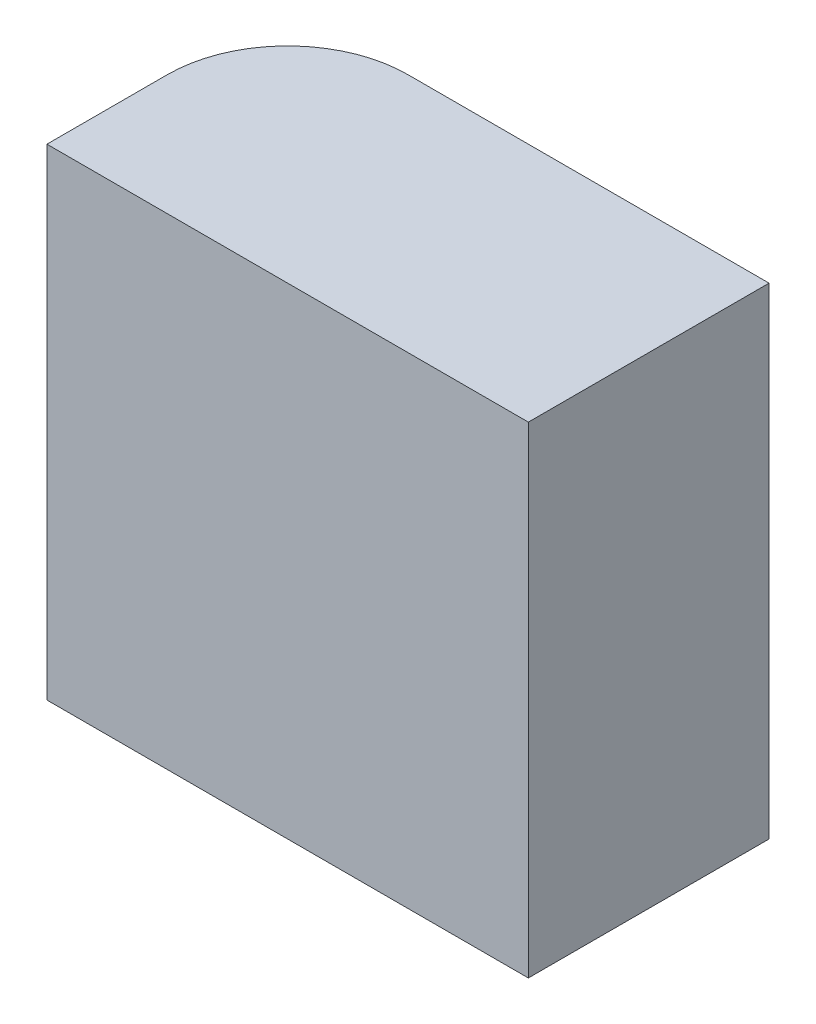
ISO-10303-21;
HEADER;
FILE_DESCRIPTION(('STEP AP214'),'2;1');
FILE_NAME('part.step','',(''),(''),'','','');
FILE_SCHEMA(('AUTOMOTIVE_DESIGN { 1 0 10303 214 1 1 1 1 }'));
ENDSEC;
DATA;
#1=APPLICATION_CONTEXT('core data for automotive mechanical design processes');
#2=APPLICATION_PROTOCOL_DEFINITION('international standard','automotive_design',2000,#1);
#3=PRODUCT_CONTEXT('',#1,'mechanical');
#4=PRODUCT('Part','Part','',(#3));
#5=PRODUCT_RELATED_PRODUCT_CATEGORY('part','',(#4));
#6=PRODUCT_DEFINITION_FORMATION('','',#4);
#7=PRODUCT_DEFINITION_CONTEXT('part definition',#1,'design');
#8=PRODUCT_DEFINITION('design','',#6,#7);
#9=PRODUCT_DEFINITION_SHAPE('','',#8);
#10=(LENGTH_UNIT() NAMED_UNIT(*) SI_UNIT(.MILLI.,.METRE.));
#11=(NAMED_UNIT(*) PLANE_ANGLE_UNIT() SI_UNIT($,.RADIAN.));
#12=(NAMED_UNIT(*) SI_UNIT($,.STERADIAN.) SOLID_ANGLE_UNIT());
#13=UNCERTAINTY_MEASURE_WITH_UNIT(LENGTH_MEASURE(1.E-05),#10,'distance_accuracy_value','');
#14=(GEOMETRIC_REPRESENTATION_CONTEXT(3) GLOBAL_UNCERTAINTY_ASSIGNED_CONTEXT((#13)) GLOBAL_UNIT_ASSIGNED_CONTEXT((#10,
#11,#12)) REPRESENTATION_CONTEXT('',''));
#15=CARTESIAN_POINT('',(0.,0.,0.));
#16=DIRECTION('',(0.,0.,1.));
#17=DIRECTION('',(1.,0.,0.));
#18=AXIS2_PLACEMENT_3D('',#15,#16,#17);
#19=CARTESIAN_POINT('',(-5.,20.,10.));
#20=DIRECTION('',(1.,0.,0.));
#21=DIRECTION('',(0.,0.,-1.));
#22=AXIS2_PLACEMENT_3D('',#19,#20,#21);
#23=PLANE('',#22);
#24=DIRECTION('',(0.,0.,1.));
#25=VECTOR('',#24,1.);
#26=CARTESIAN_POINT('',(-5.,0.,10.));
#27=LINE('',#26,#25);
#28=CARTESIAN_POINT('',(-5.,0.,5.));
#29=VERTEX_POINT('',#28);
#30=CARTESIAN_POINT('',(-5.,0.,10.));
#31=VERTEX_POINT('',#30);
#32=EDGE_CURVE('E111',#29,#31,#27,.T.);
#33=ORIENTED_EDGE('',*,*,#32,.T.);
#34=DIRECTION('',(0.,-1.,0.));
#35=VECTOR('',#34,1.);
#36=CARTESIAN_POINT('',(-5.,20.,10.));
#37=LINE('',#36,#35);
#38=CARTESIAN_POINT('',(-5.,20.,10.));
#39=VERTEX_POINT('',#38);
#40=EDGE_CURVE('E11',#39,#31,#37,.T.);
#41=ORIENTED_EDGE('',*,*,#40,.F.);
#42=DIRECTION('',(0.,0.,1.));
#43=VECTOR('',#42,1.);
#44=CARTESIAN_POINT('',(-5.,20.,10.));
#45=LINE('',#44,#43);
#46=CARTESIAN_POINT('',(-5.,20.,5.));
#47=VERTEX_POINT('',#46);
#48=EDGE_CURVE('E119',#47,#39,#45,.T.);
#49=ORIENTED_EDGE('',*,*,#48,.F.);
#50=DIRECTION('',(0.,-1.,0.));
#51=VECTOR('',#50,1.);
#52=CARTESIAN_POINT('',(-5.,20.,5.));
#53=LINE('',#52,#51);
#54=EDGE_CURVE('E107',#47,#29,#53,.T.);
#55=ORIENTED_EDGE('',*,*,#54,.T.);
#56=EDGE_LOOP('',(#33,#41,#49,#55));
#57=FACE_BOUND('',#56,.T.);
#58=ADVANCED_FACE('F37',(#57),#23,.F.);
#59=CARTESIAN_POINT('',(-5.,20.,10.));
#60=DIRECTION('',(0.,0.,-1.));
#61=DIRECTION('',(-1.,0.,0.));
#62=AXIS2_PLACEMENT_3D('',#59,#60,#61);
#63=PLANE('',#62);
#64=DIRECTION('',(1.,0.,0.));
#65=VECTOR('',#64,1.);
#66=CARTESIAN_POINT('',(-5.,0.,10.));
#67=LINE('',#66,#65);
#68=CARTESIAN_POINT('',(15.,0.,10.));
#69=VERTEX_POINT('',#68);
#70=EDGE_CURVE('E114',#31,#69,#67,.T.);
#71=ORIENTED_EDGE('',*,*,#70,.T.);
#72=DIRECTION('',(0.,-1.,0.));
#73=VECTOR('',#72,1.);
#74=CARTESIAN_POINT('',(15.,20.,10.));
#75=LINE('',#74,#73);
#76=CARTESIAN_POINT('',(15.,20.,10.));
#77=VERTEX_POINT('',#76);
#78=EDGE_CURVE('E45',#77,#69,#75,.T.);
#79=ORIENTED_EDGE('',*,*,#78,.F.);
#80=DIRECTION('',(1.,0.,0.));
#81=VECTOR('',#80,1.);
#82=CARTESIAN_POINT('',(-5.,20.,10.));
#83=LINE('',#82,#81);
#84=EDGE_CURVE('E87',#39,#77,#83,.T.);
#85=ORIENTED_EDGE('',*,*,#84,.F.);
#86=ORIENTED_EDGE('',*,*,#40,.T.);
#87=EDGE_LOOP('',(#71,#79,#85,#86));
#88=FACE_BOUND('',#87,.T.);
#89=ADVANCED_FACE('F138',(#88),#63,.F.);
#90=CARTESIAN_POINT('',(15.,20.,10.));
#91=DIRECTION('',(-1.,0.,0.));
#92=DIRECTION('',(0.,0.,1.));
#93=AXIS2_PLACEMENT_3D('',#90,#91,#92);
#94=PLANE('',#93);
#95=DIRECTION('',(0.,0.,-1.));
#96=VECTOR('',#95,1.);
#97=CARTESIAN_POINT('',(15.,0.,10.));
#98=LINE('',#97,#96);
#99=CARTESIAN_POINT('',(15.,0.,0.));
#100=VERTEX_POINT('',#99);
#101=EDGE_CURVE('E102',#69,#100,#98,.T.);
#102=ORIENTED_EDGE('',*,*,#101,.T.);
#103=DIRECTION('',(0.,-1.,0.));
#104=VECTOR('',#103,1.);
#105=CARTESIAN_POINT('',(15.,20.,0.));
#106=LINE('',#105,#104);
#107=CARTESIAN_POINT('',(15.,20.,0.));
#108=VERTEX_POINT('',#107);
#109=EDGE_CURVE('E99',#108,#100,#106,.T.);
#110=ORIENTED_EDGE('',*,*,#109,.F.);
#111=DIRECTION('',(0.,0.,-1.));
#112=VECTOR('',#111,1.);
#113=CARTESIAN_POINT('',(15.,20.,10.));
#114=LINE('',#113,#112);
#115=EDGE_CURVE('E91',#77,#108,#114,.T.);
#116=ORIENTED_EDGE('',*,*,#115,.F.);
#117=ORIENTED_EDGE('',*,*,#78,.T.);
#118=EDGE_LOOP('',(#102,#110,#116,#117));
#119=FACE_BOUND('',#118,.T.);
#120=ADVANCED_FACE('F100',(#119),#94,.F.);
#121=CARTESIAN_POINT('',(0.,20.,0.));
#122=DIRECTION('',(0.,0.,1.));
#123=DIRECTION('',(1.,0.,0.));
#124=AXIS2_PLACEMENT_3D('',#121,#122,#123);
#125=PLANE('',#124);
#126=DIRECTION('',(-1.,0.,0.));
#127=VECTOR('',#126,1.);
#128=CARTESIAN_POINT('',(0.,0.,0.));
#129=LINE('',#128,#127);
#130=CARTESIAN_POINT('',(0.,0.,0.));
#131=VERTEX_POINT('',#130);
#132=EDGE_CURVE('E73',#100,#131,#129,.T.);
#133=ORIENTED_EDGE('',*,*,#132,.T.);
#134=DIRECTION('',(0.,-1.,0.));
#135=VECTOR('',#134,1.);
#136=CARTESIAN_POINT('',(0.,20.,0.));
#137=LINE('',#136,#135);
#138=CARTESIAN_POINT('',(0.,20.,0.));
#139=VERTEX_POINT('',#138);
#140=EDGE_CURVE('E103',#139,#131,#137,.T.);
#141=ORIENTED_EDGE('',*,*,#140,.F.);
#142=DIRECTION('',(-1.,0.,0.));
#143=VECTOR('',#142,1.);
#144=CARTESIAN_POINT('',(0.,20.,0.));
#145=LINE('',#144,#143);
#146=EDGE_CURVE('E95',#108,#139,#145,.T.);
#147=ORIENTED_EDGE('',*,*,#146,.F.);
#148=ORIENTED_EDGE('',*,*,#109,.T.);
#149=EDGE_LOOP('',(#133,#141,#147,#148));
#150=FACE_BOUND('',#149,.T.);
#151=ADVANCED_FACE('F105',(#150),#125,.F.);
#152=CARTESIAN_POINT('',(0.,20.,5.));
#153=DIRECTION('',(0.,-1.,0.));
#154=DIRECTION('',(0.,0.,-1.));
#155=AXIS2_PLACEMENT_3D('',#152,#153,#154);
#156=CYLINDRICAL_SURFACE('',#155,5.);
#157=CARTESIAN_POINT('',(0.,0.,5.));
#158=DIRECTION('',(0.,1.,0.));
#159=DIRECTION('',(0.,0.,-1.));
#160=AXIS2_PLACEMENT_3D('',#157,#158,#159);
#161=CIRCLE('',#160,5.);
#162=EDGE_CURVE('E79',#131,#29,#161,.T.);
#163=ORIENTED_EDGE('',*,*,#162,.T.);
#164=ORIENTED_EDGE('',*,*,#54,.F.);
#165=CARTESIAN_POINT('',(0.,20.,5.));
#166=DIRECTION('',(0.,1.,0.));
#167=DIRECTION('',(0.,0.,-1.));
#168=AXIS2_PLACEMENT_3D('',#165,#166,#167);
#169=CIRCLE('',#168,5.);
#170=EDGE_CURVE('E53',#139,#47,#169,.T.);
#171=ORIENTED_EDGE('',*,*,#170,.F.);
#172=ORIENTED_EDGE('',*,*,#140,.T.);
#173=EDGE_LOOP('',(#163,#164,#171,#172));
#174=FACE_BOUND('',#173,.T.);
#175=ADVANCED_FACE('F127',(#174),#156,.T.);
#176=CARTESIAN_POINT('',(0.,20.,5.));
#177=DIRECTION('',(0.,-1.,0.));
#178=DIRECTION('',(0.,0.,-1.));
#179=AXIS2_PLACEMENT_3D('',#176,#177,#178);
#180=PLANE('',#179);
#181=ORIENTED_EDGE('',*,*,#48,.T.);
#182=ORIENTED_EDGE('',*,*,#84,.T.);
#183=ORIENTED_EDGE('',*,*,#115,.T.);
#184=ORIENTED_EDGE('',*,*,#146,.T.);
#185=ORIENTED_EDGE('',*,*,#170,.T.);
#186=EDGE_LOOP('',(#181,#182,#183,#184,#185));
#187=FACE_BOUND('',#186,.T.);
#188=ADVANCED_FACE('F93',(#187),#180,.F.);
#189=CARTESIAN_POINT('',(0.,0.,5.));
#190=DIRECTION('',(0.,-1.,0.));
#191=DIRECTION('',(0.,0.,-1.));
#192=AXIS2_PLACEMENT_3D('',#189,#190,#191);
#193=PLANE('',#192);
#194=ORIENTED_EDGE('',*,*,#32,.F.);
#195=ORIENTED_EDGE('',*,*,#162,.F.);
#196=ORIENTED_EDGE('',*,*,#132,.F.);
#197=ORIENTED_EDGE('',*,*,#101,.F.);
#198=ORIENTED_EDGE('',*,*,#70,.F.);
#199=EDGE_LOOP('',(#194,#195,#196,#197,#198));
#200=FACE_BOUND('',#199,.T.);
#201=ADVANCED_FACE('F123',(#200),#193,.T.);
#202=CLOSED_SHELL('',(#58,#89,#120,#151,#175,#188,#201));
#203=MANIFOLD_SOLID_BREP('B2',#202);
#204=ADVANCED_BREP_SHAPE_REPRESENTATION('',(#18,#203),#14);
#205=SHAPE_DEFINITION_REPRESENTATION(#9,#204);
ENDSEC;
END-ISO-10303-21;
